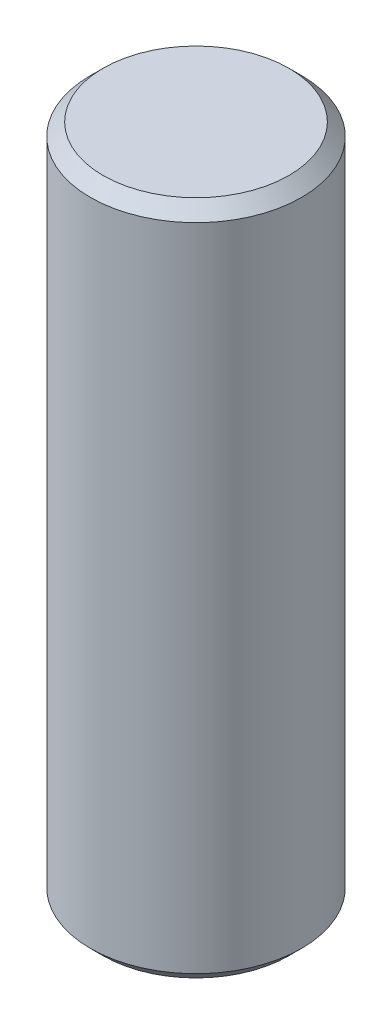
ISO-10303-21;
HEADER;
FILE_DESCRIPTION(('STEP AP214'),'2;1');
FILE_NAME('part.step','',(''),(''),'','','');
FILE_SCHEMA(('AUTOMOTIVE_DESIGN { 1 0 10303 214 1 1 1 1 }'));
ENDSEC;
DATA;
#1=APPLICATION_CONTEXT('core data for automotive mechanical design processes');
#2=APPLICATION_PROTOCOL_DEFINITION('international standard','automotive_design',2000,#1);
#3=PRODUCT_CONTEXT('',#1,'mechanical');
#4=PRODUCT('Part','Part','',(#3));
#5=PRODUCT_RELATED_PRODUCT_CATEGORY('part','',(#4));
#6=PRODUCT_DEFINITION_FORMATION('','',#4);
#7=PRODUCT_DEFINITION_CONTEXT('part definition',#1,'design');
#8=PRODUCT_DEFINITION('design','',#6,#7);
#9=PRODUCT_DEFINITION_SHAPE('','',#8);
#10=(LENGTH_UNIT() NAMED_UNIT(*) SI_UNIT(.MILLI.,.METRE.));
#11=(NAMED_UNIT(*) PLANE_ANGLE_UNIT() SI_UNIT($,.RADIAN.));
#12=(NAMED_UNIT(*) SI_UNIT($,.STERADIAN.) SOLID_ANGLE_UNIT());
#13=UNCERTAINTY_MEASURE_WITH_UNIT(LENGTH_MEASURE(1.E-05),#10,'distance_accuracy_value','');
#14=(GEOMETRIC_REPRESENTATION_CONTEXT(3) GLOBAL_UNCERTAINTY_ASSIGNED_CONTEXT((#13)) GLOBAL_UNIT_ASSIGNED_CONTEXT((#10,
#11,#12)) REPRESENTATION_CONTEXT('',''));
#15=CARTESIAN_POINT('',(0.,0.,0.));
#16=DIRECTION('',(0.,0.,1.));
#17=DIRECTION('',(1.,0.,0.));
#18=AXIS2_PLACEMENT_3D('',#15,#16,#17);
#19=CARTESIAN_POINT('',(0.,16.,0.));
#20=DIRECTION('',(0.,-1.,0.));
#21=DIRECTION('',(0.,0.,-1.));
#22=AXIS2_PLACEMENT_3D('',#19,#20,#21);
#23=CYLINDRICAL_SURFACE('',#22,2.5);
#24=CARTESIAN_POINT('',(0.,0.300000000000002,0.));
#25=DIRECTION('',(0.,1.,0.));
#26=DIRECTION('',(0.,0.,1.));
#27=AXIS2_PLACEMENT_3D('',#24,#25,#26);
#28=CIRCLE('',#27,2.5);
#29=CARTESIAN_POINT('',(0.,0.300000000000002,2.5));
#30=VERTEX_POINT('',#29);
#31=EDGE_CURVE('E57',#30,#30,#28,.T.);
#32=ORIENTED_EDGE('',*,*,#31,.T.);
#33=EDGE_LOOP('',(#32));
#34=FACE_BOUND('',#33,.T.);
#35=CARTESIAN_POINT('',(0.,15.7,0.));
#36=DIRECTION('',(0.,1.,0.));
#37=DIRECTION('',(0.,0.,1.));
#38=AXIS2_PLACEMENT_3D('',#35,#36,#37);
#39=CIRCLE('',#38,2.5);
#40=CARTESIAN_POINT('',(0.,15.7,-2.5));
#41=VERTEX_POINT('',#40);
#42=EDGE_CURVE('E62',#41,#41,#39,.F.);
#43=ORIENTED_EDGE('',*,*,#42,.T.);
#44=EDGE_LOOP('',(#43));
#45=FACE_BOUND('',#44,.T.);
#46=ADVANCED_FACE('F43',(#34,#45),#23,.T.);
#47=CARTESIAN_POINT('',(0.,16.,0.));
#48=DIRECTION('',(0.,1.,0.));
#49=DIRECTION('',(0.,0.,1.));
#50=AXIS2_PLACEMENT_3D('',#47,#48,#49);
#51=PLANE('',#50);
#52=CARTESIAN_POINT('',(0.,16.,0.));
#53=DIRECTION('',(0.,1.,0.));
#54=DIRECTION('',(0.,0.,1.));
#55=AXIS2_PLACEMENT_3D('',#52,#53,#54);
#56=CIRCLE('',#55,2.2);
#57=CARTESIAN_POINT('',(0.,16.,-2.2));
#58=VERTEX_POINT('',#57);
#59=EDGE_CURVE('E10',#58,#58,#56,.T.);
#60=ORIENTED_EDGE('',*,*,#59,.T.);
#61=EDGE_LOOP('',(#60));
#62=FACE_BOUND('',#61,.T.);
#63=ADVANCED_FACE('F79',(#62),#51,.T.);
#64=CARTESIAN_POINT('',(0.,0.,0.));
#65=DIRECTION('',(0.,1.,0.));
#66=DIRECTION('',(0.,0.,1.));
#67=AXIS2_PLACEMENT_3D('',#64,#65,#66);
#68=PLANE('',#67);
#69=CARTESIAN_POINT('',(0.,0.,0.));
#70=DIRECTION('',(0.,1.,0.));
#71=DIRECTION('',(0.,0.,1.));
#72=AXIS2_PLACEMENT_3D('',#69,#70,#71);
#73=CIRCLE('',#72,2.2);
#74=CARTESIAN_POINT('',(0.,0.,2.2));
#75=VERTEX_POINT('',#74);
#76=EDGE_CURVE('E52',#75,#75,#73,.F.);
#77=ORIENTED_EDGE('',*,*,#76,.T.);
#78=EDGE_LOOP('',(#77));
#79=FACE_BOUND('',#78,.T.);
#80=ADVANCED_FACE('F76',(#79),#68,.F.);
#81=CARTESIAN_POINT('',(0.,0.300000000000002,0.));
#82=DIRECTION('',(0.,1.,0.));
#83=DIRECTION('',(0.,0.,1.));
#84=AXIS2_PLACEMENT_3D('',#81,#82,#83);
#85=CONICAL_SURFACE('',#84,2.5,0.785398163397453);
#86=ORIENTED_EDGE('',*,*,#76,.F.);
#87=EDGE_LOOP('',(#86));
#88=FACE_BOUND('',#87,.T.);
#89=ORIENTED_EDGE('',*,*,#31,.F.);
#90=EDGE_LOOP('',(#89));
#91=FACE_BOUND('',#90,.T.);
#92=ADVANCED_FACE('F72',(#88,#91),#85,.T.);
#93=CARTESIAN_POINT('',(0.,16.,0.));
#94=DIRECTION('',(0.,-1.,0.));
#95=DIRECTION('',(0.,0.,-1.));
#96=AXIS2_PLACEMENT_3D('',#93,#94,#95);
#97=CONICAL_SURFACE('',#96,2.2,0.785398163397442);
#98=CARTESIAN_POINT('',(0.,15.7,-2.5));
#99=CARTESIAN_POINT('',(0.,15.703125,-2.496875));
#100=CARTESIAN_POINT('',(0.,15.70625,-2.49375));
#101=CARTESIAN_POINT('',(0.,15.7125,-2.4875));
#102=CARTESIAN_POINT('',(0.,15.715625,-2.484375));
#103=CARTESIAN_POINT('',(0.,15.721875,-2.478125));
#104=CARTESIAN_POINT('',(0.,15.725,-2.475));
#105=CARTESIAN_POINT('',(0.,15.73125,-2.46875));
#106=CARTESIAN_POINT('',(0.,15.734375,-2.465625));
#107=CARTESIAN_POINT('',(0.,15.740625,-2.459375));
#108=CARTESIAN_POINT('',(0.,15.74375,-2.45625));
#109=CARTESIAN_POINT('',(0.,15.75,-2.45));
#110=CARTESIAN_POINT('',(0.,15.753125,-2.446875));
#111=CARTESIAN_POINT('',(0.,15.759375,-2.440625));
#112=CARTESIAN_POINT('',(0.,15.7625,-2.4375));
#113=CARTESIAN_POINT('',(0.,15.76875,-2.43125));
#114=CARTESIAN_POINT('',(0.,15.771875,-2.428125));
#115=CARTESIAN_POINT('',(0.,15.778125,-2.421875));
#116=CARTESIAN_POINT('',(0.,15.78125,-2.41875));
#117=CARTESIAN_POINT('',(0.,15.7875,-2.4125));
#118=CARTESIAN_POINT('',(0.,15.790625,-2.409375));
#119=CARTESIAN_POINT('',(0.,15.796875,-2.403125));
#120=CARTESIAN_POINT('',(0.,15.8,-2.4));
#121=CARTESIAN_POINT('',(0.,15.80625,-2.39375));
#122=CARTESIAN_POINT('',(0.,15.809375,-2.390625));
#123=CARTESIAN_POINT('',(0.,15.815625,-2.384375));
#124=CARTESIAN_POINT('',(0.,15.81875,-2.38125));
#125=CARTESIAN_POINT('',(0.,15.825,-2.375));
#126=CARTESIAN_POINT('',(0.,15.828125,-2.371875));
#127=CARTESIAN_POINT('',(0.,15.834375,-2.365625));
#128=CARTESIAN_POINT('',(0.,15.8375,-2.3625));
#129=CARTESIAN_POINT('',(0.,15.84375,-2.35625));
#130=CARTESIAN_POINT('',(0.,15.846875,-2.353125));
#131=CARTESIAN_POINT('',(0.,15.853125,-2.346875));
#132=CARTESIAN_POINT('',(0.,15.85625,-2.34375));
#133=CARTESIAN_POINT('',(0.,15.8625,-2.3375));
#134=CARTESIAN_POINT('',(0.,15.865625,-2.334375));
#135=CARTESIAN_POINT('',(0.,15.871875,-2.328125));
#136=CARTESIAN_POINT('',(0.,15.875,-2.325));
#137=CARTESIAN_POINT('',(0.,15.88125,-2.31875));
#138=CARTESIAN_POINT('',(0.,15.884375,-2.315625));
#139=CARTESIAN_POINT('',(0.,15.890625,-2.309375));
#140=CARTESIAN_POINT('',(0.,15.89375,-2.30625));
#141=CARTESIAN_POINT('',(0.,15.9,-2.3));
#142=CARTESIAN_POINT('',(0.,15.903125,-2.296875));
#143=CARTESIAN_POINT('',(0.,15.909375,-2.290625));
#144=CARTESIAN_POINT('',(0.,15.9125,-2.2875));
#145=CARTESIAN_POINT('',(0.,15.91875,-2.28125));
#146=CARTESIAN_POINT('',(0.,15.921875,-2.278125));
#147=CARTESIAN_POINT('',(0.,15.928125,-2.271875));
#148=CARTESIAN_POINT('',(0.,15.93125,-2.26875));
#149=CARTESIAN_POINT('',(0.,15.9375,-2.2625));
#150=CARTESIAN_POINT('',(0.,15.940625,-2.259375));
#151=CARTESIAN_POINT('',(0.,15.946875,-2.253125));
#152=CARTESIAN_POINT('',(0.,15.95,-2.25));
#153=CARTESIAN_POINT('',(0.,15.95625,-2.24375));
#154=CARTESIAN_POINT('',(0.,15.959375,-2.240625));
#155=CARTESIAN_POINT('',(0.,15.965625,-2.234375));
#156=CARTESIAN_POINT('',(0.,15.96875,-2.23125));
#157=CARTESIAN_POINT('',(0.,15.975,-2.225));
#158=CARTESIAN_POINT('',(0.,15.978125,-2.221875));
#159=CARTESIAN_POINT('',(0.,15.984375,-2.215625));
#160=CARTESIAN_POINT('',(0.,15.9875,-2.2125));
#161=CARTESIAN_POINT('',(0.,15.99375,-2.20625));
#162=CARTESIAN_POINT('',(0.,15.996875,-2.203125));
#163=CARTESIAN_POINT('',(0.,16.,-2.2));
#164=B_SPLINE_CURVE_WITH_KNOTS('',3,(#98,#99,#100,#101,#102,#103,#104,#105,#106,#107,#108,#109,
#110,#111,#112,#113,#114,#115,#116,#117,#118,#119,#120,#121,#122,#123,#124,#125,#126,#127,#128,
#129,#130,#131,#132,#133,#134,#135,#136,#137,#138,#139,#140,#141,#142,#143,#144,#145,#146,#147,
#148,#149,#150,#151,#152,#153,#154,#155,#156,#157,#158,#159,#160,#161,#162,#163),.UNSPECIFIED.,
.F.,.F.,(4,2,2,2,2,2,2,2,2,2,2,2,2,2,2,2,2,2,2,2,2,2,2,2,2,2,2,2,2,2,2,2,4),(0.,
0.0132582521472472,0.0265165042944941,0.0397747564417435,0.0530330085889907,0.0662912607362377,
0.0795495128834873,0.0928077650307343,0.106066017177981,0.119324269325231,0.132582521472478,
0.145840773619725,0.159099025766975,0.172357277914222,0.185615530061469,0.198873782208718,
0.212132034355965,0.225390286503212,0.238648538650462,0.251906790797709,0.265165042944956,
0.278423295092206,0.291681547239452,0.3049397993867,0.318198051533949,0.331456303681196,
0.344714555828443,0.357972807975693,0.37123106012294,0.384489312270187,0.397747564417436,
0.411005816564684,0.424264068711933),.UNSPECIFIED.);
#165=EDGE_CURVE('BSEAM46',#41,#58,#164,.T.);
#166=ORIENTED_EDGE('',*,*,#42,.F.);
#167=ORIENTED_EDGE('',*,*,#59,.F.);
#168=ORIENTED_EDGE('',*,*,#165,.T.);
#169=ORIENTED_EDGE('',*,*,#165,.F.);
#170=EDGE_LOOP('',(#166,#168,#167,#169));
#171=FACE_BOUND('',#170,.T.);
#172=ADVANCED_FACE('F46',(#171),#97,.T.);
#173=CLOSED_SHELL('',(#46,#63,#80,#92,#172));
#174=MANIFOLD_SOLID_BREP('B2',#173);
#175=ADVANCED_BREP_SHAPE_REPRESENTATION('',(#18,#174),#14);
#176=SHAPE_DEFINITION_REPRESENTATION(#9,#175);
ENDSEC;
END-ISO-10303-21;
